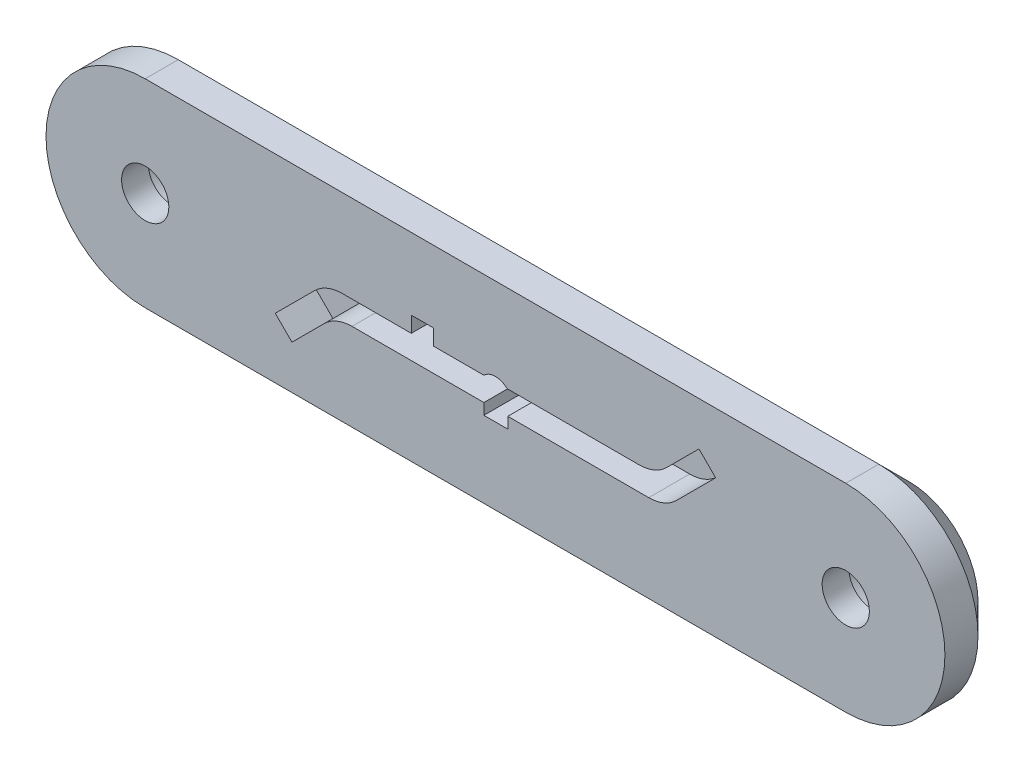
ISO-10303-21;
HEADER;
FILE_DESCRIPTION(('STEP AP214'),'2;1');
FILE_NAME('part.step','',(''),(''),'','','');
FILE_SCHEMA(('AUTOMOTIVE_DESIGN { 1 0 10303 214 1 1 1 1 }'));
ENDSEC;
DATA;
#1=APPLICATION_CONTEXT('core data for automotive mechanical design processes');
#2=APPLICATION_PROTOCOL_DEFINITION('international standard','automotive_design',2000,#1);
#3=PRODUCT_CONTEXT('',#1,'mechanical');
#4=PRODUCT('Part','Part','',(#3));
#5=PRODUCT_RELATED_PRODUCT_CATEGORY('part','',(#4));
#6=PRODUCT_DEFINITION_FORMATION('','',#4);
#7=PRODUCT_DEFINITION_CONTEXT('part definition',#1,'design');
#8=PRODUCT_DEFINITION('design','',#6,#7);
#9=PRODUCT_DEFINITION_SHAPE('','',#8);
#10=(LENGTH_UNIT() NAMED_UNIT(*) SI_UNIT(.MILLI.,.METRE.));
#11=(NAMED_UNIT(*) PLANE_ANGLE_UNIT() SI_UNIT($,.RADIAN.));
#12=(NAMED_UNIT(*) SI_UNIT($,.STERADIAN.) SOLID_ANGLE_UNIT());
#13=UNCERTAINTY_MEASURE_WITH_UNIT(LENGTH_MEASURE(1.E-05),#10,'distance_accuracy_value','');
#14=(GEOMETRIC_REPRESENTATION_CONTEXT(3) GLOBAL_UNCERTAINTY_ASSIGNED_CONTEXT((#13)) GLOBAL_UNIT_ASSIGNED_CONTEXT((#10,
#11,#12)) REPRESENTATION_CONTEXT('',''));
#15=CARTESIAN_POINT('',(0.,0.,0.));
#16=DIRECTION('',(0.,0.,1.));
#17=DIRECTION('',(1.,0.,0.));
#18=AXIS2_PLACEMENT_3D('',#15,#16,#17);
#19=CARTESIAN_POINT('',(0.,12.6,-4.2));
#20=DIRECTION('',(0.,0.707106781186548,-0.707106781186547));
#21=DIRECTION('',(1.,0.,0.));
#22=AXIS2_PLACEMENT_3D('',#19,#20,#21);
#23=PLANE('',#22);
#24=DIRECTION('',(0.,-0.707106781186547,-0.707106781186548));
#25=VECTOR('',#24,1.);
#26=CARTESIAN_POINT('',(0.,12.6,-4.2));
#27=LINE('',#26,#25);
#28=CARTESIAN_POINT('',(0.,12.6,-4.2));
#29=VERTEX_POINT('',#28);
#30=CARTESIAN_POINT('',(0.,8.8,-8.));
#31=VERTEX_POINT('',#30);
#32=EDGE_CURVE('E13',#29,#31,#27,.T.);
#33=ORIENTED_EDGE('',*,*,#32,.F.);
#34=DIRECTION('',(-1.,0.,0.));
#35=VECTOR('',#34,1.);
#36=CARTESIAN_POINT('',(88.9828144262295,12.6,-4.2));
#37=LINE('',#36,#35);
#38=CARTESIAN_POINT('',(88.9828144262295,12.6,-4.2));
#39=VERTEX_POINT('',#38);
#40=EDGE_CURVE('E563',#39,#29,#37,.T.);
#41=ORIENTED_EDGE('',*,*,#40,.F.);
#42=DIRECTION('',(0.,0.707106781186547,0.707106781186548));
#43=VECTOR('',#42,1.);
#44=CARTESIAN_POINT('',(88.9828144262295,12.6,-4.2));
#45=LINE('',#44,#43);
#46=CARTESIAN_POINT('',(88.9828144262295,8.8,-8.));
#47=VERTEX_POINT('',#46);
#48=EDGE_CURVE('E56',#39,#47,#45,.F.);
#49=ORIENTED_EDGE('',*,*,#48,.T.);
#50=DIRECTION('',(1.,0.,0.));
#51=VECTOR('',#50,1.);
#52=CARTESIAN_POINT('',(88.9828144262295,8.8,-8.));
#53=LINE('',#52,#51);
#54=EDGE_CURVE('E539',#31,#47,#53,.T.);
#55=ORIENTED_EDGE('',*,*,#54,.F.);
#56=EDGE_LOOP('',(#33,#41,#49,#55));
#57=FACE_BOUND('',#56,.T.);
#58=ADVANCED_FACE('F46',(#57),#23,.T.);
#59=CARTESIAN_POINT('',(88.9828144262295,0.,-4.2));
#60=DIRECTION('',(0.,0.,1.));
#61=DIRECTION('',(1.,0.,0.));
#62=AXIS2_PLACEMENT_3D('',#59,#60,#61);
#63=CONICAL_SURFACE('',#62,12.6,0.785398163397448);
#64=ORIENTED_EDGE('',*,*,#48,.F.);
#65=CARTESIAN_POINT('',(88.9828144262295,0.,-4.2));
#66=DIRECTION('',(0.,0.,1.));
#67=DIRECTION('',(1.,0.,0.));
#68=AXIS2_PLACEMENT_3D('',#65,#66,#67);
#69=CIRCLE('',#68,12.6);
#70=CARTESIAN_POINT('',(88.9828144262295,-12.6,-4.2));
#71=VERTEX_POINT('',#70);
#72=EDGE_CURVE('E559',#71,#39,#69,.T.);
#73=ORIENTED_EDGE('',*,*,#72,.F.);
#74=DIRECTION('',(0.,0.707106781186547,-0.707106781186548));
#75=VECTOR('',#74,1.);
#76=CARTESIAN_POINT('',(88.9828144262295,-12.6,-4.2));
#77=LINE('',#76,#75);
#78=CARTESIAN_POINT('',(88.9828144262295,-8.8,-8.));
#79=VERTEX_POINT('',#78);
#80=EDGE_CURVE('E570',#71,#79,#77,.T.);
#81=ORIENTED_EDGE('',*,*,#80,.T.);
#82=CARTESIAN_POINT('',(88.9828144262295,0.,-8.));
#83=DIRECTION('',(0.,0.,1.));
#84=DIRECTION('',(1.,0.,0.));
#85=AXIS2_PLACEMENT_3D('',#82,#83,#84);
#86=CIRCLE('',#85,8.8);
#87=EDGE_CURVE('E543',#47,#79,#86,.F.);
#88=ORIENTED_EDGE('',*,*,#87,.F.);
#89=EDGE_LOOP('',(#64,#73,#81,#88));
#90=FACE_BOUND('',#89,.T.);
#91=ADVANCED_FACE('F625',(#90),#63,.T.);
#92=CARTESIAN_POINT('',(0.,-12.6,-4.2));
#93=DIRECTION('',(0.,-0.707106781186548,-0.707106781186547));
#94=DIRECTION('',(-1.,0.,0.));
#95=AXIS2_PLACEMENT_3D('',#92,#93,#94);
#96=PLANE('',#95);
#97=ORIENTED_EDGE('',*,*,#80,.F.);
#98=DIRECTION('',(1.,0.,0.));
#99=VECTOR('',#98,1.);
#100=CARTESIAN_POINT('',(0.,-12.6,-4.2));
#101=LINE('',#100,#99);
#102=CARTESIAN_POINT('',(0.,-12.6,-4.2));
#103=VERTEX_POINT('',#102);
#104=EDGE_CURVE('E555',#103,#71,#101,.T.);
#105=ORIENTED_EDGE('',*,*,#104,.F.);
#106=DIRECTION('',(0.,-0.707106781186547,0.707106781186548));
#107=VECTOR('',#106,1.);
#108=CARTESIAN_POINT('',(0.,-12.6,-4.2));
#109=LINE('',#108,#107);
#110=CARTESIAN_POINT('',(0.,-8.8,-8.));
#111=VERTEX_POINT('',#110);
#112=EDGE_CURVE('E567',#103,#111,#109,.F.);
#113=ORIENTED_EDGE('',*,*,#112,.T.);
#114=DIRECTION('',(-1.,0.,0.));
#115=VECTOR('',#114,1.);
#116=CARTESIAN_POINT('',(0.,-8.8,-8.));
#117=LINE('',#116,#115);
#118=EDGE_CURVE('E547',#79,#111,#117,.T.);
#119=ORIENTED_EDGE('',*,*,#118,.F.);
#120=EDGE_LOOP('',(#97,#105,#113,#119));
#121=FACE_BOUND('',#120,.T.);
#122=ADVANCED_FACE('F624',(#121),#96,.T.);
#123=CARTESIAN_POINT('',(0.,0.,-4.2));
#124=DIRECTION('',(0.,0.,1.));
#125=DIRECTION('',(1.,0.,0.));
#126=AXIS2_PLACEMENT_3D('',#123,#124,#125);
#127=CONICAL_SURFACE('',#126,12.6,0.785398163397448);
#128=CARTESIAN_POINT('',(0.,0.,-4.2));
#129=DIRECTION('',(0.,0.,1.));
#130=DIRECTION('',(1.,0.,0.));
#131=AXIS2_PLACEMENT_3D('',#128,#129,#130);
#132=CIRCLE('',#131,12.6);
#133=EDGE_CURVE('E527',#29,#103,#132,.T.);
#134=ORIENTED_EDGE('',*,*,#133,.F.);
#135=ORIENTED_EDGE('',*,*,#32,.T.);
#136=CARTESIAN_POINT('',(0.,0.,-8.));
#137=DIRECTION('',(0.,0.,1.));
#138=DIRECTION('',(1.,0.,0.));
#139=AXIS2_PLACEMENT_3D('',#136,#137,#138);
#140=CIRCLE('',#139,8.8);
#141=EDGE_CURVE('E551',#111,#31,#140,.F.);
#142=ORIENTED_EDGE('',*,*,#141,.F.);
#143=ORIENTED_EDGE('',*,*,#112,.F.);
#144=EDGE_LOOP('',(#134,#135,#142,#143));
#145=FACE_BOUND('',#144,.T.);
#146=ADVANCED_FACE('F620',(#145),#127,.T.);
#147=CARTESIAN_POINT('',(0.,0.,-4.5));
#148=DIRECTION('',(0.,0.,1.));
#149=DIRECTION('',(1.,0.,0.));
#150=AXIS2_PLACEMENT_3D('',#147,#148,#149);
#151=CYLINDRICAL_SURFACE('',#150,12.6);
#152=DIRECTION('',(0.,0.,1.));
#153=VECTOR('',#152,1.);
#154=CARTESIAN_POINT('',(0.,12.6,-4.5));
#155=LINE('',#154,#153);
#156=CARTESIAN_POINT('',(0.,12.6,0.));
#157=VERTEX_POINT('',#156);
#158=EDGE_CURVE('E524',#29,#157,#155,.T.);
#159=ORIENTED_EDGE('',*,*,#158,.F.);
#160=ORIENTED_EDGE('',*,*,#133,.T.);
#161=DIRECTION('',(0.,0.,1.));
#162=VECTOR('',#161,1.);
#163=CARTESIAN_POINT('',(0.,-12.6,-4.5));
#164=LINE('',#163,#162);
#165=CARTESIAN_POINT('',(0.,-12.6,0.));
#166=VERTEX_POINT('',#165);
#167=EDGE_CURVE('E523',#103,#166,#164,.T.);
#168=ORIENTED_EDGE('',*,*,#167,.T.);
#169=CARTESIAN_POINT('',(0.,0.,0.));
#170=DIRECTION('',(0.,0.,1.));
#171=DIRECTION('',(1.,0.,0.));
#172=AXIS2_PLACEMENT_3D('',#169,#170,#171);
#173=CIRCLE('',#172,12.6);
#174=EDGE_CURVE('E503',#157,#166,#173,.T.);
#175=ORIENTED_EDGE('',*,*,#174,.F.);
#176=EDGE_LOOP('',(#159,#160,#168,#175));
#177=FACE_BOUND('',#176,.T.);
#178=ADVANCED_FACE('F606',(#177),#151,.T.);
#179=CARTESIAN_POINT('',(0.,12.6,-4.5));
#180=DIRECTION('',(0.,1.,0.));
#181=DIRECTION('',(-1.,0.,0.));
#182=AXIS2_PLACEMENT_3D('',#179,#180,#181);
#183=PLANE('',#182);
#184=DIRECTION('',(0.,0.,1.));
#185=VECTOR('',#184,1.);
#186=CARTESIAN_POINT('',(88.9828144262295,12.6,-4.5));
#187=LINE('',#186,#185);
#188=CARTESIAN_POINT('',(88.9828144262295,12.6,0.));
#189=VERTEX_POINT('',#188);
#190=EDGE_CURVE('E528',#39,#189,#187,.T.);
#191=ORIENTED_EDGE('',*,*,#190,.F.);
#192=ORIENTED_EDGE('',*,*,#40,.T.);
#193=ORIENTED_EDGE('',*,*,#158,.T.);
#194=DIRECTION('',(-1.,0.,0.));
#195=VECTOR('',#194,1.);
#196=CARTESIAN_POINT('',(0.,12.6,0.));
#197=LINE('',#196,#195);
#198=EDGE_CURVE('E519',#189,#157,#197,.T.);
#199=ORIENTED_EDGE('',*,*,#198,.F.);
#200=EDGE_LOOP('',(#191,#192,#193,#199));
#201=FACE_BOUND('',#200,.T.);
#202=ADVANCED_FACE('F617',(#201),#183,.T.);
#203=CARTESIAN_POINT('',(88.9828144262295,0.,-4.5));
#204=DIRECTION('',(0.,0.,1.));
#205=DIRECTION('',(1.,0.,0.));
#206=AXIS2_PLACEMENT_3D('',#203,#204,#205);
#207=CYLINDRICAL_SURFACE('',#206,12.6);
#208=DIRECTION('',(0.,0.,1.));
#209=VECTOR('',#208,1.);
#210=CARTESIAN_POINT('',(88.9828144262295,-12.6,-4.5));
#211=LINE('',#210,#209);
#212=CARTESIAN_POINT('',(88.9828144262295,-12.6,0.));
#213=VERTEX_POINT('',#212);
#214=EDGE_CURVE('E531',#71,#213,#211,.T.);
#215=ORIENTED_EDGE('',*,*,#214,.F.);
#216=ORIENTED_EDGE('',*,*,#72,.T.);
#217=ORIENTED_EDGE('',*,*,#190,.T.);
#218=CARTESIAN_POINT('',(88.9828144262295,0.,0.));
#219=DIRECTION('',(0.,0.,1.));
#220=DIRECTION('',(1.,0.,0.));
#221=AXIS2_PLACEMENT_3D('',#218,#219,#220);
#222=CIRCLE('',#221,12.6);
#223=EDGE_CURVE('E515',#213,#189,#222,.T.);
#224=ORIENTED_EDGE('',*,*,#223,.F.);
#225=EDGE_LOOP('',(#215,#216,#217,#224));
#226=FACE_BOUND('',#225,.T.);
#227=ADVANCED_FACE('F614',(#226),#207,.T.);
#228=CARTESIAN_POINT('',(0.,-12.6,-4.5));
#229=DIRECTION('',(0.,-1.,0.));
#230=DIRECTION('',(1.,0.,0.));
#231=AXIS2_PLACEMENT_3D('',#228,#229,#230);
#232=PLANE('',#231);
#233=ORIENTED_EDGE('',*,*,#167,.F.);
#234=ORIENTED_EDGE('',*,*,#104,.T.);
#235=ORIENTED_EDGE('',*,*,#214,.T.);
#236=DIRECTION('',(1.,0.,0.));
#237=VECTOR('',#236,1.);
#238=CARTESIAN_POINT('',(0.,-12.6,0.));
#239=LINE('',#238,#237);
#240=EDGE_CURVE('E511',#166,#213,#239,.T.);
#241=ORIENTED_EDGE('',*,*,#240,.F.);
#242=EDGE_LOOP('',(#233,#234,#235,#241));
#243=FACE_BOUND('',#242,.T.);
#244=ADVANCED_FACE('F598',(#243),#232,.T.);
#245=CARTESIAN_POINT('',(0.,0.,0.));
#246=DIRECTION('',(0.,0.,1.));
#247=DIRECTION('',(1.,0.,0.));
#248=AXIS2_PLACEMENT_3D('',#245,#246,#247);
#249=PLANE('',#248);
#250=DIRECTION('',(-0.707106781186549,0.707106781186546,0.));
#251=VECTOR('',#250,1.);
#252=CARTESIAN_POINT('',(72.4599473986615,4.93160824574064,0.));
#253=LINE('',#252,#251);
#254=CARTESIAN_POINT('',(72.4599473986615,4.93160824574064,0.));
#255=VERTEX_POINT('',#254);
#256=CARTESIAN_POINT('',(70.3386270551019,7.05292858930025,0.));
#257=VERTEX_POINT('',#256);
#258=EDGE_CURVE('E64',#255,#257,#253,.T.);
#259=ORIENTED_EDGE('',*,*,#258,.F.);
#260=DIRECTION('',(0.707106781186546,0.707106781186549,0.));
#261=VECTOR('',#260,1.);
#262=CARTESIAN_POINT('',(67.4928052469881,-0.0355339059327155,0.));
#263=LINE('',#262,#261);
#264=CARTESIAN_POINT('',(67.4928052469881,-0.0355339059327155,0.));
#265=VERTEX_POINT('',#264);
#266=EDGE_CURVE('E257',#265,#255,#263,.T.);
#267=ORIENTED_EDGE('',*,*,#266,.F.);
#268=CARTESIAN_POINT('',(63.9572713410554,3.5,0.));
#269=DIRECTION('',(0.,0.,1.));
#270=DIRECTION('',(1.,0.,0.));
#271=AXIS2_PLACEMENT_3D('',#268,#269,#270);
#272=CIRCLE('',#271,5.);
#273=CARTESIAN_POINT('',(63.9572713410554,-1.5,0.));
#274=VERTEX_POINT('',#273);
#275=EDGE_CURVE('E262',#274,#265,#272,.T.);
#276=ORIENTED_EDGE('',*,*,#275,.F.);
#277=DIRECTION('',(1.,0.,0.));
#278=VECTOR('',#277,1.);
#279=CARTESIAN_POINT('',(63.9572713410554,-1.5,0.));
#280=LINE('',#279,#278);
#281=CARTESIAN_POINT('',(46.0557849695992,-1.5,0.));
#282=VERTEX_POINT('',#281);
#283=EDGE_CURVE('E413',#282,#274,#280,.T.);
#284=ORIENTED_EDGE('',*,*,#283,.F.);
#285=DIRECTION('',(0.,1.,0.));
#286=VECTOR('',#285,1.);
#287=CARTESIAN_POINT('',(46.0557849695992,-2.91,0.));
#288=LINE('',#287,#286);
#289=CARTESIAN_POINT('',(46.0557849695992,-2.91,0.));
#290=VERTEX_POINT('',#289);
#291=EDGE_CURVE('E409',#290,#282,#288,.T.);
#292=ORIENTED_EDGE('',*,*,#291,.F.);
#293=DIRECTION('',(1.,0.,0.));
#294=VECTOR('',#293,1.);
#295=CARTESIAN_POINT('',(43.0217133674448,-2.91,0.));
#296=LINE('',#295,#294);
#297=CARTESIAN_POINT('',(43.0217133674448,-2.91,0.));
#298=VERTEX_POINT('',#297);
#299=EDGE_CURVE('E405',#298,#290,#296,.T.);
#300=ORIENTED_EDGE('',*,*,#299,.F.);
#301=DIRECTION('',(0.,-1.,0.));
#302=VECTOR('',#301,1.);
#303=CARTESIAN_POINT('',(43.0217133674448,-1.5,0.));
#304=LINE('',#303,#302);
#305=CARTESIAN_POINT('',(43.0217133674448,-1.5,0.));
#306=VERTEX_POINT('',#305);
#307=EDGE_CURVE('E401',#306,#298,#304,.T.);
#308=ORIENTED_EDGE('',*,*,#307,.F.);
#309=DIRECTION('',(1.,0.,0.));
#310=VECTOR('',#309,1.);
#311=CARTESIAN_POINT('',(26.2681837722934,-1.5,0.));
#312=LINE('',#311,#310);
#313=CARTESIAN_POINT('',(26.2681837722934,-1.5,0.));
#314=VERTEX_POINT('',#313);
#315=EDGE_CURVE('E397',#314,#306,#312,.T.);
#316=ORIENTED_EDGE('',*,*,#315,.F.);
#317=CARTESIAN_POINT('',(26.2681837722934,-6.5,0.));
#318=DIRECTION('',(0.,0.,-1.));
#319=DIRECTION('',(1.,0.,0.));
#320=AXIS2_PLACEMENT_3D('',#317,#318,#319);
#321=CIRCLE('',#320,5.);
#322=CARTESIAN_POINT('',(22.7326498663607,-2.96446609406727,0.));
#323=VERTEX_POINT('',#322);
#324=EDGE_CURVE('E393',#323,#314,#321,.T.);
#325=ORIENTED_EDGE('',*,*,#324,.F.);
#326=DIRECTION('',(0.707106781186548,0.707106781186547,0.));
#327=VECTOR('',#326,1.);
#328=CARTESIAN_POINT('',(22.7326498663607,-2.96446609406727,0.));
#329=LINE('',#328,#327);
#330=CARTESIAN_POINT('',(18.6441873711277,-7.05292858930027,0.));
#331=VERTEX_POINT('',#330);
#332=EDGE_CURVE('E389',#331,#323,#329,.T.);
#333=ORIENTED_EDGE('',*,*,#332,.F.);
#334=DIRECTION('',(0.707106781186548,-0.707106781186547,0.));
#335=VECTOR('',#334,1.);
#336=CARTESIAN_POINT('',(18.6441873711277,-7.05292858930027,0.));
#337=LINE('',#336,#335);
#338=CARTESIAN_POINT('',(16.522867027568,-4.93160824574063,0.));
#339=VERTEX_POINT('',#338);
#340=EDGE_CURVE('E385',#339,#331,#337,.T.);
#341=ORIENTED_EDGE('',*,*,#340,.F.);
#342=DIRECTION('',(-0.707106781186546,-0.707106781186549,0.));
#343=VECTOR('',#342,1.);
#344=CARTESIAN_POINT('',(16.522867027568,-4.93160824574063,0.));
#345=LINE('',#344,#343);
#346=CARTESIAN_POINT('',(21.4900091792413,0.035533905932717,0.));
#347=VERTEX_POINT('',#346);
#348=EDGE_CURVE('E381',#347,#339,#345,.T.);
#349=ORIENTED_EDGE('',*,*,#348,.F.);
#350=CARTESIAN_POINT('',(25.0255430851741,-3.5,0.));
#351=DIRECTION('',(0.,0.,1.));
#352=DIRECTION('',(1.,0.,0.));
#353=AXIS2_PLACEMENT_3D('',#350,#351,#352);
#354=CIRCLE('',#353,5.);
#355=CARTESIAN_POINT('',(25.0255430851741,1.5,0.));
#356=VERTEX_POINT('',#355);
#357=EDGE_CURVE('E377',#356,#347,#354,.T.);
#358=ORIENTED_EDGE('',*,*,#357,.F.);
#359=DIRECTION('',(-1.,0.,0.));
#360=VECTOR('',#359,1.);
#361=CARTESIAN_POINT('',(25.0255430851741,1.5,0.));
#362=LINE('',#361,#360);
#363=CARTESIAN_POINT('',(33.8,1.5,0.));
#364=VERTEX_POINT('',#363);
#365=EDGE_CURVE('E373',#364,#356,#362,.T.);
#366=ORIENTED_EDGE('',*,*,#365,.F.);
#367=DIRECTION('',(0.,-1.,0.));
#368=VECTOR('',#367,1.);
#369=CARTESIAN_POINT('',(33.8,1.5,0.));
#370=LINE('',#369,#368);
#371=CARTESIAN_POINT('',(33.8,3.5,0.));
#372=VERTEX_POINT('',#371);
#373=EDGE_CURVE('E369',#372,#364,#370,.T.);
#374=ORIENTED_EDGE('',*,*,#373,.F.);
#375=DIRECTION('',(-1.,0.,0.));
#376=VECTOR('',#375,1.);
#377=CARTESIAN_POINT('',(33.8,3.5,0.));
#378=LINE('',#377,#376);
#379=CARTESIAN_POINT('',(36.6,3.5,0.));
#380=VERTEX_POINT('',#379);
#381=EDGE_CURVE('E365',#380,#372,#378,.T.);
#382=ORIENTED_EDGE('',*,*,#381,.F.);
#383=DIRECTION('',(0.,1.,0.));
#384=VECTOR('',#383,1.);
#385=CARTESIAN_POINT('',(36.6,3.5,0.));
#386=LINE('',#385,#384);
#387=CARTESIAN_POINT('',(36.6,1.5,0.));
#388=VERTEX_POINT('',#387);
#389=EDGE_CURVE('E361',#388,#380,#386,.T.);
#390=ORIENTED_EDGE('',*,*,#389,.F.);
#391=DIRECTION('',(-1.,0.,0.));
#392=VECTOR('',#391,1.);
#393=CARTESIAN_POINT('',(36.6,1.5,0.));
#394=LINE('',#393,#392);
#395=CARTESIAN_POINT('',(43.0217133674448,1.5,0.));
#396=VERTEX_POINT('',#395);
#397=EDGE_CURVE('E357',#396,#388,#394,.T.);
#398=ORIENTED_EDGE('',*,*,#397,.F.);
#399=CARTESIAN_POINT('',(44.4914072131147,0.,0.));
#400=DIRECTION('',(0.,0.,1.));
#401=DIRECTION('',(1.,0.,0.));
#402=AXIS2_PLACEMENT_3D('',#399,#400,#401);
#403=CIRCLE('',#402,2.1);
#404=CARTESIAN_POINT('',(45.9611010587846,1.5,0.));
#405=VERTEX_POINT('',#404);
#406=EDGE_CURVE('E353',#405,#396,#403,.T.);
#407=ORIENTED_EDGE('',*,*,#406,.F.);
#408=DIRECTION('',(-1.,0.,0.));
#409=VECTOR('',#408,1.);
#410=CARTESIAN_POINT('',(62.7146306539361,1.5,0.));
#411=LINE('',#410,#409);
#412=CARTESIAN_POINT('',(62.7146306539361,1.5,0.));
#413=VERTEX_POINT('',#412);
#414=EDGE_CURVE('E349',#413,#405,#411,.T.);
#415=ORIENTED_EDGE('',*,*,#414,.F.);
#416=CARTESIAN_POINT('',(62.7146306539361,6.5,0.));
#417=DIRECTION('',(0.,0.,-1.));
#418=DIRECTION('',(1.,0.,0.));
#419=AXIS2_PLACEMENT_3D('',#416,#417,#418);
#420=CIRCLE('',#419,5.);
#421=CARTESIAN_POINT('',(66.2501645598689,2.96446609406729,0.));
#422=VERTEX_POINT('',#421);
#423=EDGE_CURVE('E345',#422,#413,#420,.T.);
#424=ORIENTED_EDGE('',*,*,#423,.F.);
#425=DIRECTION('',(-0.707106781186546,-0.707106781186549,0.));
#426=VECTOR('',#425,1.);
#427=CARTESIAN_POINT('',(70.3386270551019,7.05292858930025,0.));
#428=LINE('',#427,#426);
#429=EDGE_CURVE('E342',#257,#422,#428,.T.);
#430=ORIENTED_EDGE('',*,*,#429,.F.);
#431=EDGE_LOOP('',(#259,#267,#276,#284,#292,#300,#308,#316,#325,#333,#341,#349,#358,#366,#374,
#382,#390,#398,#407,#415,#424,#430));
#432=FACE_BOUND('',#431,.T.);
#433=CARTESIAN_POINT('',(88.9828144262295,0.,0.));
#434=DIRECTION('',(0.,0.,1.));
#435=DIRECTION('',(1.,0.,0.));
#436=AXIS2_PLACEMENT_3D('',#433,#434,#435);
#437=CIRCLE('',#436,3.00000000000001);
#438=CARTESIAN_POINT('',(91.9828144262295,0.,0.));
#439=VERTEX_POINT('',#438);
#440=EDGE_CURVE('E499',#439,#439,#437,.T.);
#441=ORIENTED_EDGE('',*,*,#440,.F.);
#442=EDGE_LOOP('',(#441));
#443=FACE_BOUND('',#442,.T.);
#444=CARTESIAN_POINT('',(0.,0.,0.));
#445=DIRECTION('',(0.,0.,1.));
#446=DIRECTION('',(1.,0.,0.));
#447=AXIS2_PLACEMENT_3D('',#444,#445,#446);
#448=CIRCLE('',#447,3.);
#449=CARTESIAN_POINT('',(3.,0.,0.));
#450=VERTEX_POINT('',#449);
#451=EDGE_CURVE('E504',#450,#450,#448,.T.);
#452=ORIENTED_EDGE('',*,*,#451,.F.);
#453=EDGE_LOOP('',(#452));
#454=FACE_BOUND('',#453,.T.);
#455=ORIENTED_EDGE('',*,*,#174,.T.);
#456=ORIENTED_EDGE('',*,*,#240,.T.);
#457=ORIENTED_EDGE('',*,*,#223,.T.);
#458=ORIENTED_EDGE('',*,*,#198,.T.);
#459=EDGE_LOOP('',(#455,#456,#457,#458));
#460=FACE_BOUND('',#459,.T.);
#461=ADVANCED_FACE('F595',(#432,#443,#454,#460),#249,.T.);
#462=CARTESIAN_POINT('',(89.7414072131147,0.,-8.));
#463=DIRECTION('',(0.,0.,1.));
#464=DIRECTION('',(1.,0.,0.));
#465=AXIS2_PLACEMENT_3D('',#462,#463,#464);
#466=PLANE('',#465);
#467=CARTESIAN_POINT('',(88.9828144262295,0.,-8.));
#468=DIRECTION('',(0.,0.,1.));
#469=DIRECTION('',(1.,0.,0.));
#470=AXIS2_PLACEMENT_3D('',#467,#468,#469);
#471=CIRCLE('',#470,5.25);
#472=CARTESIAN_POINT('',(94.2328144262295,0.,-8.));
#473=VERTEX_POINT('',#472);
#474=EDGE_CURVE('E488',#473,#473,#471,.T.);
#475=ORIENTED_EDGE('',*,*,#474,.T.);
#476=EDGE_LOOP('',(#475));
#477=FACE_BOUND('',#476,.T.);
#478=CARTESIAN_POINT('',(0.,0.,-8.));
#479=DIRECTION('',(0.,0.,1.));
#480=DIRECTION('',(1.,0.,0.));
#481=AXIS2_PLACEMENT_3D('',#478,#479,#480);
#482=CIRCLE('',#481,5.25);
#483=CARTESIAN_POINT('',(5.25,0.,-8.));
#484=VERTEX_POINT('',#483);
#485=EDGE_CURVE('E492',#484,#484,#482,.T.);
#486=ORIENTED_EDGE('',*,*,#485,.T.);
#487=EDGE_LOOP('',(#486));
#488=FACE_BOUND('',#487,.T.);
#489=ORIENTED_EDGE('',*,*,#118,.T.);
#490=ORIENTED_EDGE('',*,*,#141,.T.);
#491=ORIENTED_EDGE('',*,*,#54,.T.);
#492=ORIENTED_EDGE('',*,*,#87,.T.);
#493=EDGE_LOOP('',(#489,#490,#491,#492));
#494=FACE_BOUND('',#493,.T.);
#495=ADVANCED_FACE('F591',(#477,#488,#494),#466,.F.);
#496=CARTESIAN_POINT('',(0.,0.,0.));
#497=DIRECTION('',(0.,0.,-1.));
#498=DIRECTION('',(-1.,0.,0.));
#499=AXIS2_PLACEMENT_3D('',#496,#497,#498);
#500=CYLINDRICAL_SURFACE('',#499,3.);
#501=CARTESIAN_POINT('',(0.,0.,-3.4));
#502=DIRECTION('',(0.,0.,1.));
#503=DIRECTION('',(1.,0.,0.));
#504=AXIS2_PLACEMENT_3D('',#501,#502,#503);
#505=CIRCLE('',#504,3.);
#506=CARTESIAN_POINT('',(3.,0.,-3.4));
#507=VERTEX_POINT('',#506);
#508=EDGE_CURVE('E50',#507,#507,#505,.T.);
#509=ORIENTED_EDGE('',*,*,#508,.F.);
#510=EDGE_LOOP('',(#509));
#511=FACE_BOUND('',#510,.T.);
#512=ORIENTED_EDGE('',*,*,#451,.T.);
#513=EDGE_LOOP('',(#512));
#514=FACE_BOUND('',#513,.T.);
#515=ADVANCED_FACE('F587',(#511,#514),#500,.F.);
#516=CARTESIAN_POINT('',(88.9828144262295,0.,0.));
#517=DIRECTION('',(0.,0.,-1.));
#518=DIRECTION('',(-1.,0.,0.));
#519=AXIS2_PLACEMENT_3D('',#516,#517,#518);
#520=CYLINDRICAL_SURFACE('',#519,3.00000000000001);
#521=CARTESIAN_POINT('',(88.9828144262295,0.,-3.4));
#522=DIRECTION('',(0.,0.,1.));
#523=DIRECTION('',(1.,0.,0.));
#524=AXIS2_PLACEMENT_3D('',#521,#522,#523);
#525=CIRCLE('',#524,3.00000000000001);
#526=CARTESIAN_POINT('',(91.9828144262295,0.,-3.4));
#527=VERTEX_POINT('',#526);
#528=EDGE_CURVE('E487',#527,#527,#525,.T.);
#529=ORIENTED_EDGE('',*,*,#528,.F.);
#530=EDGE_LOOP('',(#529));
#531=FACE_BOUND('',#530,.T.);
#532=ORIENTED_EDGE('',*,*,#440,.T.);
#533=EDGE_LOOP('',(#532));
#534=FACE_BOUND('',#533,.T.);
#535=ADVANCED_FACE('F590',(#531,#534),#520,.F.);
#536=CARTESIAN_POINT('',(88.9828144262295,0.,-3.4));
#537=DIRECTION('',(0.,0.,-1.));
#538=DIRECTION('',(-1.,0.,0.));
#539=AXIS2_PLACEMENT_3D('',#536,#537,#538);
#540=CYLINDRICAL_SURFACE('',#539,5.25);
#541=CARTESIAN_POINT('',(88.9828144262295,0.,-3.4));
#542=DIRECTION('',(0.,0.,1.));
#543=DIRECTION('',(1.,0.,0.));
#544=AXIS2_PLACEMENT_3D('',#541,#542,#543);
#545=CIRCLE('',#544,5.25);
#546=CARTESIAN_POINT('',(94.2328144262295,0.,-3.4));
#547=VERTEX_POINT('',#546);
#548=EDGE_CURVE('E483',#547,#547,#545,.T.);
#549=ORIENTED_EDGE('',*,*,#548,.T.);
#550=EDGE_LOOP('',(#549));
#551=FACE_BOUND('',#550,.T.);
#552=ORIENTED_EDGE('',*,*,#474,.F.);
#553=EDGE_LOOP('',(#552));
#554=FACE_BOUND('',#553,.T.);
#555=ADVANCED_FACE('F657',(#551,#554),#540,.F.);
#556=CARTESIAN_POINT('',(88.9828144262295,0.,-3.4));
#557=DIRECTION('',(0.,0.,1.));
#558=DIRECTION('',(1.,0.,0.));
#559=AXIS2_PLACEMENT_3D('',#556,#557,#558);
#560=PLANE('',#559);
#561=ORIENTED_EDGE('',*,*,#528,.T.);
#562=EDGE_LOOP('',(#561));
#563=FACE_BOUND('',#562,.T.);
#564=ORIENTED_EDGE('',*,*,#548,.F.);
#565=EDGE_LOOP('',(#564));
#566=FACE_BOUND('',#565,.T.);
#567=ADVANCED_FACE('F664',(#563,#566),#560,.F.);
#568=CARTESIAN_POINT('',(0.,0.,-3.4));
#569=DIRECTION('',(0.,0.,-1.));
#570=DIRECTION('',(-1.,0.,0.));
#571=AXIS2_PLACEMENT_3D('',#568,#569,#570);
#572=CYLINDRICAL_SURFACE('',#571,5.25);
#573=CARTESIAN_POINT('',(0.,0.,-3.4));
#574=DIRECTION('',(0.,0.,1.));
#575=DIRECTION('',(1.,0.,0.));
#576=AXIS2_PLACEMENT_3D('',#573,#574,#575);
#577=CIRCLE('',#576,5.25);
#578=CARTESIAN_POINT('',(5.25,0.,-3.4));
#579=VERTEX_POINT('',#578);
#580=EDGE_CURVE('E423',#579,#579,#577,.T.);
#581=ORIENTED_EDGE('',*,*,#580,.T.);
#582=EDGE_LOOP('',(#581));
#583=FACE_BOUND('',#582,.T.);
#584=ORIENTED_EDGE('',*,*,#485,.F.);
#585=EDGE_LOOP('',(#584));
#586=FACE_BOUND('',#585,.T.);
#587=ADVANCED_FACE('F661',(#583,#586),#572,.F.);
#588=CARTESIAN_POINT('',(0.,0.,-3.4));
#589=DIRECTION('',(0.,0.,1.));
#590=DIRECTION('',(1.,0.,0.));
#591=AXIS2_PLACEMENT_3D('',#588,#589,#590);
#592=PLANE('',#591);
#593=ORIENTED_EDGE('',*,*,#508,.T.);
#594=EDGE_LOOP('',(#593));
#595=FACE_BOUND('',#594,.T.);
#596=ORIENTED_EDGE('',*,*,#580,.F.);
#597=EDGE_LOOP('',(#596));
#598=FACE_BOUND('',#597,.T.);
#599=ADVANCED_FACE('F584',(#595,#598),#592,.F.);
#600=CARTESIAN_POINT('',(72.4599473986615,4.93160824574064,-5.2));
#601=DIRECTION('',(0.707106781186546,0.707106781186549,0.));
#602=DIRECTION('',(-0.707106781186549,0.707106781186546,0.));
#603=AXIS2_PLACEMENT_3D('',#600,#601,#602);
#604=PLANE('',#603);
#605=ORIENTED_EDGE('',*,*,#258,.T.);
#606=DIRECTION('',(0.,0.,1.));
#607=VECTOR('',#606,1.);
#608=CARTESIAN_POINT('',(70.3386270551019,7.05292858930025,-5.2));
#609=LINE('',#608,#607);
#610=CARTESIAN_POINT('',(70.3386270551019,7.05292858930025,-5.2));
#611=VERTEX_POINT('',#610);
#612=EDGE_CURVE('E231',#611,#257,#609,.T.);
#613=ORIENTED_EDGE('',*,*,#612,.F.);
#614=DIRECTION('',(-0.707106781186549,0.707106781186546,0.));
#615=VECTOR('',#614,1.);
#616=CARTESIAN_POINT('',(72.4599473986615,4.93160824574064,-5.2));
#617=LINE('',#616,#615);
#618=CARTESIAN_POINT('',(72.4599473986615,4.93160824574064,-5.2));
#619=VERTEX_POINT('',#618);
#620=EDGE_CURVE('E235',#619,#611,#617,.T.);
#621=ORIENTED_EDGE('',*,*,#620,.F.);
#622=DIRECTION('',(0.,0.,1.));
#623=VECTOR('',#622,1.);
#624=CARTESIAN_POINT('',(72.4599473986615,4.93160824574064,-5.2));
#625=LINE('',#624,#623);
#626=EDGE_CURVE('E420',#619,#255,#625,.T.);
#627=ORIENTED_EDGE('',*,*,#626,.T.);
#628=EDGE_LOOP('',(#605,#613,#621,#627));
#629=FACE_BOUND('',#628,.T.);
#630=ADVANCED_FACE('F233',(#629),#604,.F.);
#631=CARTESIAN_POINT('',(67.4928052469881,-0.0355339059327155,-5.2));
#632=DIRECTION('',(0.707106781186549,-0.707106781186546,0.));
#633=DIRECTION('',(0.707106781186546,0.707106781186549,0.));
#634=AXIS2_PLACEMENT_3D('',#631,#632,#633);
#635=PLANE('',#634);
#636=ORIENTED_EDGE('',*,*,#266,.T.);
#637=ORIENTED_EDGE('',*,*,#626,.F.);
#638=DIRECTION('',(0.707106781186546,0.707106781186549,0.));
#639=VECTOR('',#638,1.);
#640=CARTESIAN_POINT('',(67.4928052469881,-0.0355339059327155,-5.2));
#641=LINE('',#640,#639);
#642=CARTESIAN_POINT('',(67.4928052469881,-0.0355339059327155,-5.2));
#643=VERTEX_POINT('',#642);
#644=EDGE_CURVE('E242',#643,#619,#641,.T.);
#645=ORIENTED_EDGE('',*,*,#644,.F.);
#646=DIRECTION('',(0.,0.,1.));
#647=VECTOR('',#646,1.);
#648=CARTESIAN_POINT('',(67.4928052469881,-0.0355339059327155,-5.2));
#649=LINE('',#648,#647);
#650=EDGE_CURVE('E424',#643,#265,#649,.T.);
#651=ORIENTED_EDGE('',*,*,#650,.T.);
#652=EDGE_LOOP('',(#636,#637,#645,#651));
#653=FACE_BOUND('',#652,.T.);
#654=ADVANCED_FACE('F673',(#653),#635,.F.);
#655=CARTESIAN_POINT('',(63.9572713410554,3.5,-5.2));
#656=DIRECTION('',(0.,0.,1.));
#657=DIRECTION('',(1.,0.,0.));
#658=AXIS2_PLACEMENT_3D('',#655,#656,#657);
#659=CYLINDRICAL_SURFACE('',#658,5.);
#660=ORIENTED_EDGE('',*,*,#275,.T.);
#661=ORIENTED_EDGE('',*,*,#650,.F.);
#662=CARTESIAN_POINT('',(63.9572713410554,3.5,-5.2));
#663=DIRECTION('',(0.,0.,1.));
#664=DIRECTION('',(1.,0.,0.));
#665=AXIS2_PLACEMENT_3D('',#662,#663,#664);
#666=CIRCLE('',#665,5.);
#667=CARTESIAN_POINT('',(63.9572713410554,-1.5,-5.2));
#668=VERTEX_POINT('',#667);
#669=EDGE_CURVE('E335',#668,#643,#666,.T.);
#670=ORIENTED_EDGE('',*,*,#669,.F.);
#671=DIRECTION('',(0.,0.,1.));
#672=VECTOR('',#671,1.);
#673=CARTESIAN_POINT('',(63.9572713410554,-1.5,-5.2));
#674=LINE('',#673,#672);
#675=EDGE_CURVE('E427',#668,#274,#674,.T.);
#676=ORIENTED_EDGE('',*,*,#675,.T.);
#677=EDGE_LOOP('',(#660,#661,#670,#676));
#678=FACE_BOUND('',#677,.T.);
#679=ADVANCED_FACE('F747',(#678),#659,.F.);
#680=CARTESIAN_POINT('',(63.9572713410554,-1.5,-5.2));
#681=DIRECTION('',(0.,-1.,0.));
#682=DIRECTION('',(1.,0.,0.));
#683=AXIS2_PLACEMENT_3D('',#680,#681,#682);
#684=PLANE('',#683);
#685=ORIENTED_EDGE('',*,*,#283,.T.);
#686=ORIENTED_EDGE('',*,*,#675,.F.);
#687=DIRECTION('',(1.,0.,0.));
#688=VECTOR('',#687,1.);
#689=CARTESIAN_POINT('',(63.9572713410554,-1.5,-5.2));
#690=LINE('',#689,#688);
#691=CARTESIAN_POINT('',(46.0557849695992,-1.5,-5.2));
#692=VERTEX_POINT('',#691);
#693=EDGE_CURVE('E331',#692,#668,#690,.T.);
#694=ORIENTED_EDGE('',*,*,#693,.F.);
#695=DIRECTION('',(0.,0.,1.));
#696=VECTOR('',#695,1.);
#697=CARTESIAN_POINT('',(46.0557849695992,-1.5,-5.2));
#698=LINE('',#697,#696);
#699=EDGE_CURVE('E430',#692,#282,#698,.T.);
#700=ORIENTED_EDGE('',*,*,#699,.T.);
#701=EDGE_LOOP('',(#685,#686,#694,#700));
#702=FACE_BOUND('',#701,.T.);
#703=ADVANCED_FACE('F743',(#702),#684,.F.);
#704=CARTESIAN_POINT('',(46.0557849695992,-2.91,-5.2));
#705=DIRECTION('',(1.,0.,0.));
#706=DIRECTION('',(0.,0.,-1.));
#707=AXIS2_PLACEMENT_3D('',#704,#705,#706);
#708=PLANE('',#707);
#709=ORIENTED_EDGE('',*,*,#291,.T.);
#710=ORIENTED_EDGE('',*,*,#699,.F.);
#711=DIRECTION('',(0.,1.,0.));
#712=VECTOR('',#711,1.);
#713=CARTESIAN_POINT('',(46.0557849695992,-2.91,-5.2));
#714=LINE('',#713,#712);
#715=CARTESIAN_POINT('',(46.0557849695992,-2.91,-5.2));
#716=VERTEX_POINT('',#715);
#717=EDGE_CURVE('E327',#716,#692,#714,.T.);
#718=ORIENTED_EDGE('',*,*,#717,.F.);
#719=DIRECTION('',(0.,0.,1.));
#720=VECTOR('',#719,1.);
#721=CARTESIAN_POINT('',(46.0557849695992,-2.91,-5.2));
#722=LINE('',#721,#720);
#723=EDGE_CURVE('E433',#716,#290,#722,.T.);
#724=ORIENTED_EDGE('',*,*,#723,.T.);
#725=EDGE_LOOP('',(#709,#710,#718,#724));
#726=FACE_BOUND('',#725,.T.);
#727=ADVANCED_FACE('F739',(#726),#708,.F.);
#728=CARTESIAN_POINT('',(43.0217133674448,-2.91,-5.2));
#729=DIRECTION('',(0.,-1.,0.));
#730=DIRECTION('',(0.,0.,-1.));
#731=AXIS2_PLACEMENT_3D('',#728,#729,#730);
#732=PLANE('',#731);
#733=ORIENTED_EDGE('',*,*,#299,.T.);
#734=ORIENTED_EDGE('',*,*,#723,.F.);
#735=DIRECTION('',(1.,0.,0.));
#736=VECTOR('',#735,1.);
#737=CARTESIAN_POINT('',(43.0217133674448,-2.91,-5.2));
#738=LINE('',#737,#736);
#739=CARTESIAN_POINT('',(43.0217133674448,-2.91,-5.2));
#740=VERTEX_POINT('',#739);
#741=EDGE_CURVE('E323',#740,#716,#738,.T.);
#742=ORIENTED_EDGE('',*,*,#741,.F.);
#743=DIRECTION('',(0.,0.,1.));
#744=VECTOR('',#743,1.);
#745=CARTESIAN_POINT('',(43.0217133674448,-2.91,-5.2));
#746=LINE('',#745,#744);
#747=EDGE_CURVE('E436',#740,#298,#746,.T.);
#748=ORIENTED_EDGE('',*,*,#747,.T.);
#749=EDGE_LOOP('',(#733,#734,#742,#748));
#750=FACE_BOUND('',#749,.T.);
#751=ADVANCED_FACE('F735',(#750),#732,.F.);
#752=CARTESIAN_POINT('',(43.0217133674448,-1.5,-5.2));
#753=DIRECTION('',(-1.,0.,0.));
#754=DIRECTION('',(0.,0.,1.));
#755=AXIS2_PLACEMENT_3D('',#752,#753,#754);
#756=PLANE('',#755);
#757=ORIENTED_EDGE('',*,*,#307,.T.);
#758=ORIENTED_EDGE('',*,*,#747,.F.);
#759=DIRECTION('',(0.,-1.,0.));
#760=VECTOR('',#759,1.);
#761=CARTESIAN_POINT('',(43.0217133674448,-1.5,-5.2));
#762=LINE('',#761,#760);
#763=CARTESIAN_POINT('',(43.0217133674448,-1.5,-5.2));
#764=VERTEX_POINT('',#763);
#765=EDGE_CURVE('E319',#764,#740,#762,.T.);
#766=ORIENTED_EDGE('',*,*,#765,.F.);
#767=DIRECTION('',(0.,0.,1.));
#768=VECTOR('',#767,1.);
#769=CARTESIAN_POINT('',(43.0217133674448,-1.5,-5.2));
#770=LINE('',#769,#768);
#771=EDGE_CURVE('E439',#764,#306,#770,.T.);
#772=ORIENTED_EDGE('',*,*,#771,.T.);
#773=EDGE_LOOP('',(#757,#758,#766,#772));
#774=FACE_BOUND('',#773,.T.);
#775=ADVANCED_FACE('F731',(#774),#756,.F.);
#776=CARTESIAN_POINT('',(26.2681837722934,-1.5,-5.2));
#777=DIRECTION('',(0.,-1.,0.));
#778=DIRECTION('',(1.,0.,0.));
#779=AXIS2_PLACEMENT_3D('',#776,#777,#778);
#780=PLANE('',#779);
#781=ORIENTED_EDGE('',*,*,#315,.T.);
#782=ORIENTED_EDGE('',*,*,#771,.F.);
#783=DIRECTION('',(1.,0.,0.));
#784=VECTOR('',#783,1.);
#785=CARTESIAN_POINT('',(26.2681837722934,-1.5,-5.2));
#786=LINE('',#785,#784);
#787=CARTESIAN_POINT('',(26.2681837722934,-1.5,-5.2));
#788=VERTEX_POINT('',#787);
#789=EDGE_CURVE('E315',#788,#764,#786,.T.);
#790=ORIENTED_EDGE('',*,*,#789,.F.);
#791=DIRECTION('',(0.,0.,1.));
#792=VECTOR('',#791,1.);
#793=CARTESIAN_POINT('',(26.2681837722934,-1.5,-5.2));
#794=LINE('',#793,#792);
#795=EDGE_CURVE('E442',#788,#314,#794,.T.);
#796=ORIENTED_EDGE('',*,*,#795,.T.);
#797=EDGE_LOOP('',(#781,#782,#790,#796));
#798=FACE_BOUND('',#797,.T.);
#799=ADVANCED_FACE('F727',(#798),#780,.F.);
#800=CARTESIAN_POINT('',(26.2681837722934,-6.5,-5.2));
#801=DIRECTION('',(0.,0.,1.));
#802=DIRECTION('',(1.,0.,0.));
#803=AXIS2_PLACEMENT_3D('',#800,#801,#802);
#804=CYLINDRICAL_SURFACE('',#803,5.);
#805=ORIENTED_EDGE('',*,*,#324,.T.);
#806=ORIENTED_EDGE('',*,*,#795,.F.);
#807=CARTESIAN_POINT('',(26.2681837722934,-6.5,-5.2));
#808=DIRECTION('',(0.,0.,-1.));
#809=DIRECTION('',(1.,0.,0.));
#810=AXIS2_PLACEMENT_3D('',#807,#808,#809);
#811=CIRCLE('',#810,5.);
#812=CARTESIAN_POINT('',(22.7326498663607,-2.96446609406727,-5.2));
#813=VERTEX_POINT('',#812);
#814=EDGE_CURVE('E311',#813,#788,#811,.T.);
#815=ORIENTED_EDGE('',*,*,#814,.F.);
#816=DIRECTION('',(0.,0.,1.));
#817=VECTOR('',#816,1.);
#818=CARTESIAN_POINT('',(22.7326498663607,-2.96446609406727,-5.2));
#819=LINE('',#818,#817);
#820=EDGE_CURVE('E445',#813,#323,#819,.T.);
#821=ORIENTED_EDGE('',*,*,#820,.T.);
#822=EDGE_LOOP('',(#805,#806,#815,#821));
#823=FACE_BOUND('',#822,.T.);
#824=ADVANCED_FACE('F723',(#823),#804,.T.);
#825=CARTESIAN_POINT('',(22.7326498663607,-2.96446609406727,-5.2));
#826=DIRECTION('',(0.707106781186547,-0.707106781186548,0.));
#827=DIRECTION('',(0.707106781186548,0.707106781186547,0.));
#828=AXIS2_PLACEMENT_3D('',#825,#826,#827);
#829=PLANE('',#828);
#830=ORIENTED_EDGE('',*,*,#332,.T.);
#831=ORIENTED_EDGE('',*,*,#820,.F.);
#832=DIRECTION('',(0.707106781186548,0.707106781186547,0.));
#833=VECTOR('',#832,1.);
#834=CARTESIAN_POINT('',(22.7326498663607,-2.96446609406727,-5.2));
#835=LINE('',#834,#833);
#836=CARTESIAN_POINT('',(18.6441873711277,-7.05292858930027,-5.2));
#837=VERTEX_POINT('',#836);
#838=EDGE_CURVE('E307',#837,#813,#835,.T.);
#839=ORIENTED_EDGE('',*,*,#838,.F.);
#840=DIRECTION('',(0.,0.,1.));
#841=VECTOR('',#840,1.);
#842=CARTESIAN_POINT('',(18.6441873711277,-7.05292858930027,-5.2));
#843=LINE('',#842,#841);
#844=EDGE_CURVE('E448',#837,#331,#843,.T.);
#845=ORIENTED_EDGE('',*,*,#844,.T.);
#846=EDGE_LOOP('',(#830,#831,#839,#845));
#847=FACE_BOUND('',#846,.T.);
#848=ADVANCED_FACE('F719',(#847),#829,.F.);
#849=CARTESIAN_POINT('',(18.6441873711277,-7.05292858930027,-5.2));
#850=DIRECTION('',(-0.707106781186547,-0.707106781186548,0.));
#851=DIRECTION('',(0.707106781186548,-0.707106781186547,0.));
#852=AXIS2_PLACEMENT_3D('',#849,#850,#851);
#853=PLANE('',#852);
#854=ORIENTED_EDGE('',*,*,#340,.T.);
#855=ORIENTED_EDGE('',*,*,#844,.F.);
#856=DIRECTION('',(0.707106781186548,-0.707106781186547,0.));
#857=VECTOR('',#856,1.);
#858=CARTESIAN_POINT('',(18.6441873711277,-7.05292858930027,-5.2));
#859=LINE('',#858,#857);
#860=CARTESIAN_POINT('',(16.522867027568,-4.93160824574063,-5.2));
#861=VERTEX_POINT('',#860);
#862=EDGE_CURVE('E303',#861,#837,#859,.T.);
#863=ORIENTED_EDGE('',*,*,#862,.F.);
#864=DIRECTION('',(0.,0.,1.));
#865=VECTOR('',#864,1.);
#866=CARTESIAN_POINT('',(16.522867027568,-4.93160824574063,-5.2));
#867=LINE('',#866,#865);
#868=EDGE_CURVE('E451',#861,#339,#867,.T.);
#869=ORIENTED_EDGE('',*,*,#868,.T.);
#870=EDGE_LOOP('',(#854,#855,#863,#869));
#871=FACE_BOUND('',#870,.T.);
#872=ADVANCED_FACE('F715',(#871),#853,.F.);
#873=CARTESIAN_POINT('',(16.522867027568,-4.93160824574063,-5.2));
#874=DIRECTION('',(-0.707106781186549,0.707106781186546,0.));
#875=DIRECTION('',(-0.707106781186546,-0.707106781186549,0.));
#876=AXIS2_PLACEMENT_3D('',#873,#874,#875);
#877=PLANE('',#876);
#878=ORIENTED_EDGE('',*,*,#348,.T.);
#879=ORIENTED_EDGE('',*,*,#868,.F.);
#880=DIRECTION('',(-0.707106781186546,-0.707106781186549,0.));
#881=VECTOR('',#880,1.);
#882=CARTESIAN_POINT('',(16.522867027568,-4.93160824574063,-5.2));
#883=LINE('',#882,#881);
#884=CARTESIAN_POINT('',(21.4900091792413,0.035533905932717,-5.2));
#885=VERTEX_POINT('',#884);
#886=EDGE_CURVE('E299',#885,#861,#883,.T.);
#887=ORIENTED_EDGE('',*,*,#886,.F.);
#888=DIRECTION('',(0.,0.,1.));
#889=VECTOR('',#888,1.);
#890=CARTESIAN_POINT('',(21.4900091792413,0.035533905932717,-5.2));
#891=LINE('',#890,#889);
#892=EDGE_CURVE('E454',#885,#347,#891,.T.);
#893=ORIENTED_EDGE('',*,*,#892,.T.);
#894=EDGE_LOOP('',(#878,#879,#887,#893));
#895=FACE_BOUND('',#894,.T.);
#896=ADVANCED_FACE('F711',(#895),#877,.F.);
#897=CARTESIAN_POINT('',(25.0255430851741,-3.5,-5.2));
#898=DIRECTION('',(0.,0.,1.));
#899=DIRECTION('',(1.,0.,0.));
#900=AXIS2_PLACEMENT_3D('',#897,#898,#899);
#901=CYLINDRICAL_SURFACE('',#900,5.);
#902=ORIENTED_EDGE('',*,*,#357,.T.);
#903=ORIENTED_EDGE('',*,*,#892,.F.);
#904=CARTESIAN_POINT('',(25.0255430851741,-3.5,-5.2));
#905=DIRECTION('',(0.,0.,1.));
#906=DIRECTION('',(1.,0.,0.));
#907=AXIS2_PLACEMENT_3D('',#904,#905,#906);
#908=CIRCLE('',#907,5.);
#909=CARTESIAN_POINT('',(25.0255430851741,1.5,-5.2));
#910=VERTEX_POINT('',#909);
#911=EDGE_CURVE('E295',#910,#885,#908,.T.);
#912=ORIENTED_EDGE('',*,*,#911,.F.);
#913=DIRECTION('',(0.,0.,1.));
#914=VECTOR('',#913,1.);
#915=CARTESIAN_POINT('',(25.0255430851741,1.5,-5.2));
#916=LINE('',#915,#914);
#917=EDGE_CURVE('E457',#910,#356,#916,.T.);
#918=ORIENTED_EDGE('',*,*,#917,.T.);
#919=EDGE_LOOP('',(#902,#903,#912,#918));
#920=FACE_BOUND('',#919,.T.);
#921=ADVANCED_FACE('F707',(#920),#901,.F.);
#922=CARTESIAN_POINT('',(25.0255430851741,1.5,-5.2));
#923=DIRECTION('',(0.,1.,0.));
#924=DIRECTION('',(-1.,0.,0.));
#925=AXIS2_PLACEMENT_3D('',#922,#923,#924);
#926=PLANE('',#925);
#927=ORIENTED_EDGE('',*,*,#365,.T.);
#928=ORIENTED_EDGE('',*,*,#917,.F.);
#929=DIRECTION('',(-1.,0.,0.));
#930=VECTOR('',#929,1.);
#931=CARTESIAN_POINT('',(25.0255430851741,1.5,-5.2));
#932=LINE('',#931,#930);
#933=CARTESIAN_POINT('',(33.8,1.5,-5.2));
#934=VERTEX_POINT('',#933);
#935=EDGE_CURVE('E291',#934,#910,#932,.T.);
#936=ORIENTED_EDGE('',*,*,#935,.F.);
#937=DIRECTION('',(0.,0.,1.));
#938=VECTOR('',#937,1.);
#939=CARTESIAN_POINT('',(33.8,1.5,-5.2));
#940=LINE('',#939,#938);
#941=EDGE_CURVE('E460',#934,#364,#940,.T.);
#942=ORIENTED_EDGE('',*,*,#941,.T.);
#943=EDGE_LOOP('',(#927,#928,#936,#942));
#944=FACE_BOUND('',#943,.T.);
#945=ADVANCED_FACE('F703',(#944),#926,.F.);
#946=CARTESIAN_POINT('',(33.8,1.5,-5.2));
#947=DIRECTION('',(-1.,0.,0.));
#948=DIRECTION('',(0.,0.,1.));
#949=AXIS2_PLACEMENT_3D('',#946,#947,#948);
#950=PLANE('',#949);
#951=ORIENTED_EDGE('',*,*,#373,.T.);
#952=ORIENTED_EDGE('',*,*,#941,.F.);
#953=DIRECTION('',(0.,-1.,0.));
#954=VECTOR('',#953,1.);
#955=CARTESIAN_POINT('',(33.8,1.5,-5.2));
#956=LINE('',#955,#954);
#957=CARTESIAN_POINT('',(33.8,3.5,-5.2));
#958=VERTEX_POINT('',#957);
#959=EDGE_CURVE('E287',#958,#934,#956,.T.);
#960=ORIENTED_EDGE('',*,*,#959,.F.);
#961=DIRECTION('',(0.,0.,1.));
#962=VECTOR('',#961,1.);
#963=CARTESIAN_POINT('',(33.8,3.5,-5.2));
#964=LINE('',#963,#962);
#965=EDGE_CURVE('E463',#958,#372,#964,.T.);
#966=ORIENTED_EDGE('',*,*,#965,.T.);
#967=EDGE_LOOP('',(#951,#952,#960,#966));
#968=FACE_BOUND('',#967,.T.);
#969=ADVANCED_FACE('F699',(#968),#950,.F.);
#970=CARTESIAN_POINT('',(33.8,3.5,-5.2));
#971=DIRECTION('',(0.,1.,0.));
#972=DIRECTION('',(0.,0.,1.));
#973=AXIS2_PLACEMENT_3D('',#970,#971,#972);
#974=PLANE('',#973);
#975=ORIENTED_EDGE('',*,*,#381,.T.);
#976=ORIENTED_EDGE('',*,*,#965,.F.);
#977=DIRECTION('',(-1.,0.,0.));
#978=VECTOR('',#977,1.);
#979=CARTESIAN_POINT('',(33.8,3.5,-5.2));
#980=LINE('',#979,#978);
#981=CARTESIAN_POINT('',(36.6,3.5,-5.2));
#982=VERTEX_POINT('',#981);
#983=EDGE_CURVE('E283',#982,#958,#980,.T.);
#984=ORIENTED_EDGE('',*,*,#983,.F.);
#985=DIRECTION('',(0.,0.,1.));
#986=VECTOR('',#985,1.);
#987=CARTESIAN_POINT('',(36.6,3.5,-5.2));
#988=LINE('',#987,#986);
#989=EDGE_CURVE('E466',#982,#380,#988,.T.);
#990=ORIENTED_EDGE('',*,*,#989,.T.);
#991=EDGE_LOOP('',(#975,#976,#984,#990));
#992=FACE_BOUND('',#991,.T.);
#993=ADVANCED_FACE('F695',(#992),#974,.F.);
#994=CARTESIAN_POINT('',(36.6,3.5,-5.2));
#995=DIRECTION('',(1.,0.,0.));
#996=DIRECTION('',(0.,0.,-1.));
#997=AXIS2_PLACEMENT_3D('',#994,#995,#996);
#998=PLANE('',#997);
#999=ORIENTED_EDGE('',*,*,#389,.T.);
#1000=ORIENTED_EDGE('',*,*,#989,.F.);
#1001=DIRECTION('',(0.,1.,0.));
#1002=VECTOR('',#1001,1.);
#1003=CARTESIAN_POINT('',(36.6,3.5,-5.2));
#1004=LINE('',#1003,#1002);
#1005=CARTESIAN_POINT('',(36.6,1.5,-5.2));
#1006=VERTEX_POINT('',#1005);
#1007=EDGE_CURVE('E279',#1006,#982,#1004,.T.);
#1008=ORIENTED_EDGE('',*,*,#1007,.F.);
#1009=DIRECTION('',(0.,0.,1.));
#1010=VECTOR('',#1009,1.);
#1011=CARTESIAN_POINT('',(36.6,1.5,-5.2));
#1012=LINE('',#1011,#1010);
#1013=EDGE_CURVE('E469',#1006,#388,#1012,.T.);
#1014=ORIENTED_EDGE('',*,*,#1013,.T.);
#1015=EDGE_LOOP('',(#999,#1000,#1008,#1014));
#1016=FACE_BOUND('',#1015,.T.);
#1017=ADVANCED_FACE('F691',(#1016),#998,.F.);
#1018=CARTESIAN_POINT('',(36.6,1.5,-5.2));
#1019=DIRECTION('',(0.,1.,0.));
#1020=DIRECTION('',(0.,0.,1.));
#1021=AXIS2_PLACEMENT_3D('',#1018,#1019,#1020);
#1022=PLANE('',#1021);
#1023=ORIENTED_EDGE('',*,*,#397,.T.);
#1024=ORIENTED_EDGE('',*,*,#1013,.F.);
#1025=DIRECTION('',(-1.,0.,0.));
#1026=VECTOR('',#1025,1.);
#1027=CARTESIAN_POINT('',(36.6,1.5,-5.2));
#1028=LINE('',#1027,#1026);
#1029=CARTESIAN_POINT('',(43.0217133674448,1.5,-5.2));
#1030=VERTEX_POINT('',#1029);
#1031=EDGE_CURVE('E275',#1030,#1006,#1028,.T.);
#1032=ORIENTED_EDGE('',*,*,#1031,.F.);
#1033=DIRECTION('',(0.,0.,1.));
#1034=VECTOR('',#1033,1.);
#1035=CARTESIAN_POINT('',(43.0217133674448,1.5,-5.2));
#1036=LINE('',#1035,#1034);
#1037=EDGE_CURVE('E472',#1030,#396,#1036,.T.);
#1038=ORIENTED_EDGE('',*,*,#1037,.T.);
#1039=EDGE_LOOP('',(#1023,#1024,#1032,#1038));
#1040=FACE_BOUND('',#1039,.T.);
#1041=ADVANCED_FACE('F687',(#1040),#1022,.F.);
#1042=CARTESIAN_POINT('',(44.4914072131147,0.,-5.2));
#1043=DIRECTION('',(0.,0.,1.));
#1044=DIRECTION('',(1.,0.,0.));
#1045=AXIS2_PLACEMENT_3D('',#1042,#1043,#1044);
#1046=CYLINDRICAL_SURFACE('',#1045,2.1);
#1047=ORIENTED_EDGE('',*,*,#406,.T.);
#1048=ORIENTED_EDGE('',*,*,#1037,.F.);
#1049=CARTESIAN_POINT('',(44.4914072131147,0.,-5.2));
#1050=DIRECTION('',(0.,0.,1.));
#1051=DIRECTION('',(1.,0.,0.));
#1052=AXIS2_PLACEMENT_3D('',#1049,#1050,#1051);
#1053=CIRCLE('',#1052,2.1);
#1054=CARTESIAN_POINT('',(45.9611010587846,1.5,-5.2));
#1055=VERTEX_POINT('',#1054);
#1056=EDGE_CURVE('E271',#1055,#1030,#1053,.T.);
#1057=ORIENTED_EDGE('',*,*,#1056,.F.);
#1058=DIRECTION('',(0.,0.,1.));
#1059=VECTOR('',#1058,1.);
#1060=CARTESIAN_POINT('',(45.9611010587846,1.5,-5.2));
#1061=LINE('',#1060,#1059);
#1062=EDGE_CURVE('E475',#1055,#405,#1061,.T.);
#1063=ORIENTED_EDGE('',*,*,#1062,.T.);
#1064=EDGE_LOOP('',(#1047,#1048,#1057,#1063));
#1065=FACE_BOUND('',#1064,.T.);
#1066=ADVANCED_FACE('F683',(#1065),#1046,.F.);
#1067=CARTESIAN_POINT('',(62.7146306539361,1.5,-5.2));
#1068=DIRECTION('',(0.,1.,0.));
#1069=DIRECTION('',(-1.,0.,0.));
#1070=AXIS2_PLACEMENT_3D('',#1067,#1068,#1069);
#1071=PLANE('',#1070);
#1072=ORIENTED_EDGE('',*,*,#414,.T.);
#1073=ORIENTED_EDGE('',*,*,#1062,.F.);
#1074=DIRECTION('',(-1.,0.,0.));
#1075=VECTOR('',#1074,1.);
#1076=CARTESIAN_POINT('',(62.7146306539361,1.5,-5.2));
#1077=LINE('',#1076,#1075);
#1078=CARTESIAN_POINT('',(62.7146306539361,1.5,-5.2));
#1079=VERTEX_POINT('',#1078);
#1080=EDGE_CURVE('E267',#1079,#1055,#1077,.T.);
#1081=ORIENTED_EDGE('',*,*,#1080,.F.);
#1082=DIRECTION('',(0.,0.,1.));
#1083=VECTOR('',#1082,1.);
#1084=CARTESIAN_POINT('',(62.7146306539361,1.5,-5.2));
#1085=LINE('',#1084,#1083);
#1086=EDGE_CURVE('E478',#1079,#413,#1085,.T.);
#1087=ORIENTED_EDGE('',*,*,#1086,.T.);
#1088=EDGE_LOOP('',(#1072,#1073,#1081,#1087));
#1089=FACE_BOUND('',#1088,.T.);
#1090=ADVANCED_FACE('F679',(#1089),#1071,.F.);
#1091=CARTESIAN_POINT('',(62.7146306539361,6.5,-5.2));
#1092=DIRECTION('',(0.,0.,1.));
#1093=DIRECTION('',(1.,0.,0.));
#1094=AXIS2_PLACEMENT_3D('',#1091,#1092,#1093);
#1095=CYLINDRICAL_SURFACE('',#1094,5.);
#1096=ORIENTED_EDGE('',*,*,#423,.T.);
#1097=ORIENTED_EDGE('',*,*,#1086,.F.);
#1098=CARTESIAN_POINT('',(62.7146306539361,6.5,-5.2));
#1099=DIRECTION('',(0.,0.,-1.));
#1100=DIRECTION('',(1.,0.,0.));
#1101=AXIS2_PLACEMENT_3D('',#1098,#1099,#1100);
#1102=CIRCLE('',#1101,5.);
#1103=CARTESIAN_POINT('',(66.2501645598689,2.96446609406729,-5.2));
#1104=VERTEX_POINT('',#1103);
#1105=EDGE_CURVE('E251',#1104,#1079,#1102,.T.);
#1106=ORIENTED_EDGE('',*,*,#1105,.F.);
#1107=DIRECTION('',(0.,0.,1.));
#1108=VECTOR('',#1107,1.);
#1109=CARTESIAN_POINT('',(66.2501645598689,2.96446609406729,-5.2));
#1110=LINE('',#1109,#1108);
#1111=EDGE_CURVE('E241',#1104,#422,#1110,.T.);
#1112=ORIENTED_EDGE('',*,*,#1111,.T.);
#1113=EDGE_LOOP('',(#1096,#1097,#1106,#1112));
#1114=FACE_BOUND('',#1113,.T.);
#1115=ADVANCED_FACE('F676',(#1114),#1095,.T.);
#1116=CARTESIAN_POINT('',(70.3386270551019,7.05292858930025,-5.2));
#1117=DIRECTION('',(-0.707106781186549,0.707106781186546,0.));
#1118=DIRECTION('',(-0.707106781186546,-0.707106781186549,0.));
#1119=AXIS2_PLACEMENT_3D('',#1116,#1117,#1118);
#1120=PLANE('',#1119);
#1121=ORIENTED_EDGE('',*,*,#429,.T.);
#1122=ORIENTED_EDGE('',*,*,#1111,.F.);
#1123=DIRECTION('',(-0.707106781186546,-0.707106781186549,0.));
#1124=VECTOR('',#1123,1.);
#1125=CARTESIAN_POINT('',(70.3386270551019,7.05292858930025,-5.2));
#1126=LINE('',#1125,#1124);
#1127=EDGE_CURVE('E245',#611,#1104,#1126,.T.);
#1128=ORIENTED_EDGE('',*,*,#1127,.F.);
#1129=ORIENTED_EDGE('',*,*,#612,.T.);
#1130=EDGE_LOOP('',(#1121,#1122,#1128,#1129));
#1131=FACE_BOUND('',#1130,.T.);
#1132=ADVANCED_FACE('F246',(#1131),#1120,.F.);
#1133=CARTESIAN_POINT('',(62.7146306539361,6.5,-5.2));
#1134=DIRECTION('',(0.,0.,1.));
#1135=DIRECTION('',(1.,0.,0.));
#1136=AXIS2_PLACEMENT_3D('',#1133,#1134,#1135);
#1137=PLANE('',#1136);
#1138=ORIENTED_EDGE('',*,*,#620,.T.);
#1139=ORIENTED_EDGE('',*,*,#1127,.T.);
#1140=ORIENTED_EDGE('',*,*,#1105,.T.);
#1141=ORIENTED_EDGE('',*,*,#1080,.T.);
#1142=ORIENTED_EDGE('',*,*,#1056,.T.);
#1143=ORIENTED_EDGE('',*,*,#1031,.T.);
#1144=ORIENTED_EDGE('',*,*,#1007,.T.);
#1145=ORIENTED_EDGE('',*,*,#983,.T.);
#1146=ORIENTED_EDGE('',*,*,#959,.T.);
#1147=ORIENTED_EDGE('',*,*,#935,.T.);
#1148=ORIENTED_EDGE('',*,*,#911,.T.);
#1149=ORIENTED_EDGE('',*,*,#886,.T.);
#1150=ORIENTED_EDGE('',*,*,#862,.T.);
#1151=ORIENTED_EDGE('',*,*,#838,.T.);
#1152=ORIENTED_EDGE('',*,*,#814,.T.);
#1153=ORIENTED_EDGE('',*,*,#789,.T.);
#1154=ORIENTED_EDGE('',*,*,#765,.T.);
#1155=ORIENTED_EDGE('',*,*,#741,.T.);
#1156=ORIENTED_EDGE('',*,*,#717,.T.);
#1157=ORIENTED_EDGE('',*,*,#693,.T.);
#1158=ORIENTED_EDGE('',*,*,#669,.T.);
#1159=ORIENTED_EDGE('',*,*,#644,.T.);
#1160=EDGE_LOOP('',(#1138,#1139,#1140,#1141,#1142,#1143,#1144,#1145,#1146,#1147,#1148,#1149,
#1150,#1151,#1152,#1153,#1154,#1155,#1156,#1157,#1158,#1159));
#1161=FACE_BOUND('',#1160,.T.);
#1162=ADVANCED_FACE('F253',(#1161),#1137,.T.);
#1163=CLOSED_SHELL('',(#58,#91,#122,#146,#178,#202,#227,#244,#461,#495,#515,#535,#555,#567,#587,
#599,#630,#654,#679,#703,#727,#751,#775,#799,#824,#848,#872,#896,#921,#945,#969,#993,#1017,
#1041,#1066,#1090,#1115,#1132,#1162));
#1164=MANIFOLD_SOLID_BREP('B2',#1163);
#1165=ADVANCED_BREP_SHAPE_REPRESENTATION('',(#18,#1164),#14);
#1166=SHAPE_DEFINITION_REPRESENTATION(#9,#1165);
ENDSEC;
END-ISO-10303-21;
